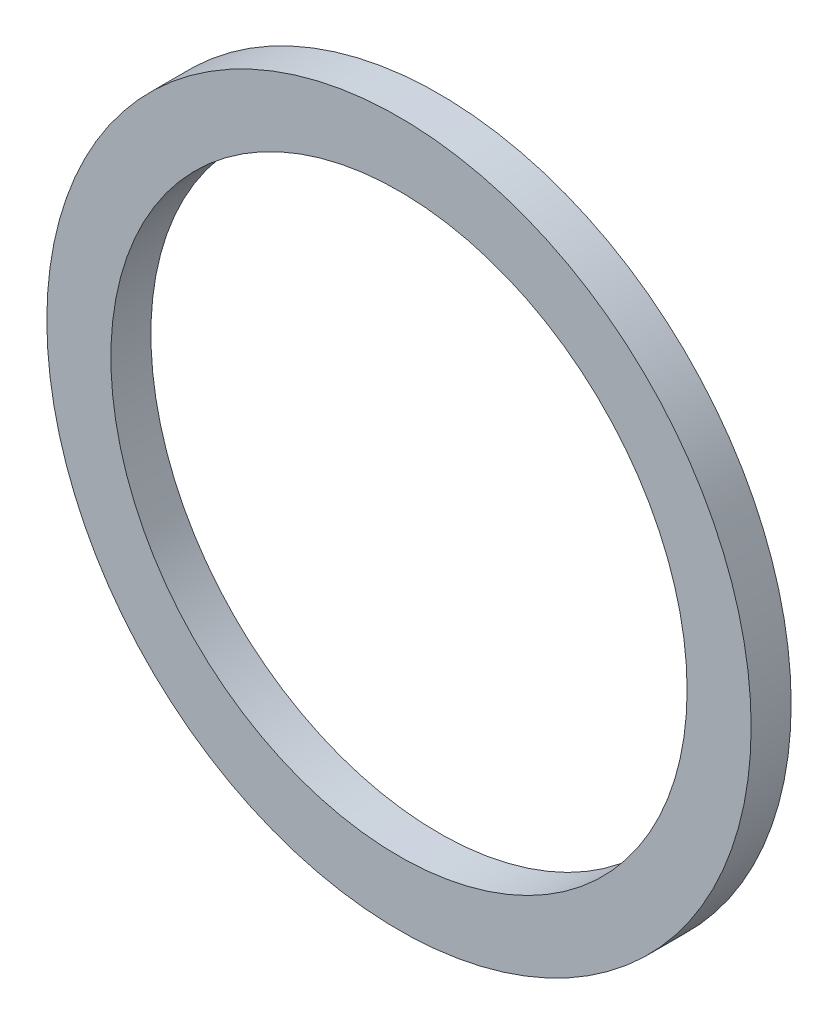
ISO-10303-21;
HEADER;
FILE_DESCRIPTION(('STEP AP214'),'2;1');
FILE_NAME('part.step','',(''),(''),'','','');
FILE_SCHEMA(('AUTOMOTIVE_DESIGN { 1 0 10303 214 1 1 1 1 }'));
ENDSEC;
DATA;
#1=APPLICATION_CONTEXT('core data for automotive mechanical design processes');
#2=APPLICATION_PROTOCOL_DEFINITION('international standard','automotive_design',2000,#1);
#3=PRODUCT_CONTEXT('',#1,'mechanical');
#4=PRODUCT('Part','Part','',(#3));
#5=PRODUCT_RELATED_PRODUCT_CATEGORY('part','',(#4));
#6=PRODUCT_DEFINITION_FORMATION('','',#4);
#7=PRODUCT_DEFINITION_CONTEXT('part definition',#1,'design');
#8=PRODUCT_DEFINITION('design','',#6,#7);
#9=PRODUCT_DEFINITION_SHAPE('','',#8);
#10=(LENGTH_UNIT() NAMED_UNIT(*) SI_UNIT(.MILLI.,.METRE.));
#11=(NAMED_UNIT(*) PLANE_ANGLE_UNIT() SI_UNIT($,.RADIAN.));
#12=(NAMED_UNIT(*) SI_UNIT($,.STERADIAN.) SOLID_ANGLE_UNIT());
#13=UNCERTAINTY_MEASURE_WITH_UNIT(LENGTH_MEASURE(1.E-05),#10,'distance_accuracy_value','');
#14=(GEOMETRIC_REPRESENTATION_CONTEXT(3) GLOBAL_UNCERTAINTY_ASSIGNED_CONTEXT((#13)) GLOBAL_UNIT_ASSIGNED_CONTEXT((#10,
#11,#12)) REPRESENTATION_CONTEXT('',''));
#15=CARTESIAN_POINT('',(0.,0.,0.));
#16=DIRECTION('',(0.,0.,1.));
#17=DIRECTION('',(1.,0.,0.));
#18=AXIS2_PLACEMENT_3D('',#15,#16,#17);
#19=CARTESIAN_POINT('',(0.,0.,1.25));
#20=DIRECTION('',(0.,0.,1.));
#21=DIRECTION('',(1.,0.,0.));
#22=AXIS2_PLACEMENT_3D('',#19,#20,#21);
#23=PLANE('',#22);
#24=CARTESIAN_POINT('',(0.,0.,1.25));
#25=DIRECTION('',(0.,0.,1.));
#26=DIRECTION('',(1.,0.,0.));
#27=AXIS2_PLACEMENT_3D('',#24,#25,#26);
#28=CIRCLE('',#27,11.);
#29=CARTESIAN_POINT('',(11.,0.,1.25));
#30=VERTEX_POINT('',#29);
#31=EDGE_CURVE('E10',#30,#30,#28,.T.);
#32=ORIENTED_EDGE('',*,*,#31,.T.);
#33=EDGE_LOOP('',(#32));
#34=FACE_BOUND('',#33,.T.);
#35=CARTESIAN_POINT('',(0.,0.,1.25));
#36=DIRECTION('',(0.,0.,1.));
#37=DIRECTION('',(1.,0.,0.));
#38=AXIS2_PLACEMENT_3D('',#35,#36,#37);
#39=CIRCLE('',#38,9.);
#40=CARTESIAN_POINT('',(9.,0.,1.25));
#41=VERTEX_POINT('',#40);
#42=EDGE_CURVE('E42',#41,#41,#39,.T.);
#43=ORIENTED_EDGE('',*,*,#42,.F.);
#44=EDGE_LOOP('',(#43));
#45=FACE_BOUND('',#44,.T.);
#46=ADVANCED_FACE('F31',(#34,#45),#23,.T.);
#47=CARTESIAN_POINT('',(0.,0.,0.));
#48=DIRECTION('',(0.,0.,1.));
#49=DIRECTION('',(1.,0.,0.));
#50=AXIS2_PLACEMENT_3D('',#47,#48,#49);
#51=PLANE('',#50);
#52=CARTESIAN_POINT('',(0.,0.,0.));
#53=DIRECTION('',(0.,0.,1.));
#54=DIRECTION('',(1.,0.,0.));
#55=AXIS2_PLACEMENT_3D('',#52,#53,#54);
#56=CIRCLE('',#55,11.);
#57=CARTESIAN_POINT('',(11.,0.,0.));
#58=VERTEX_POINT('',#57);
#59=EDGE_CURVE('E38',#58,#58,#56,.T.);
#60=ORIENTED_EDGE('',*,*,#59,.F.);
#61=EDGE_LOOP('',(#60));
#62=FACE_BOUND('',#61,.T.);
#63=CARTESIAN_POINT('',(0.,0.,0.));
#64=DIRECTION('',(0.,0.,1.));
#65=DIRECTION('',(1.,0.,0.));
#66=AXIS2_PLACEMENT_3D('',#63,#64,#65);
#67=CIRCLE('',#66,9.);
#68=CARTESIAN_POINT('',(9.,0.,0.));
#69=VERTEX_POINT('',#68);
#70=EDGE_CURVE('E46',#69,#69,#67,.T.);
#71=ORIENTED_EDGE('',*,*,#70,.T.);
#72=EDGE_LOOP('',(#71));
#73=FACE_BOUND('',#72,.T.);
#74=ADVANCED_FACE('F52',(#62,#73),#51,.F.);
#75=CARTESIAN_POINT('',(0.,0.,1.25));
#76=DIRECTION('',(0.,0.,-1.));
#77=DIRECTION('',(-1.,0.,0.));
#78=AXIS2_PLACEMENT_3D('',#75,#76,#77);
#79=CYLINDRICAL_SURFACE('',#78,11.);
#80=ORIENTED_EDGE('',*,*,#31,.F.);
#81=EDGE_LOOP('',(#80));
#82=FACE_BOUND('',#81,.T.);
#83=ORIENTED_EDGE('',*,*,#59,.T.);
#84=EDGE_LOOP('',(#83));
#85=FACE_BOUND('',#84,.T.);
#86=ADVANCED_FACE('F33',(#82,#85),#79,.T.);
#87=CARTESIAN_POINT('',(0.,0.,1.25));
#88=DIRECTION('',(0.,0.,-1.));
#89=DIRECTION('',(-1.,0.,0.));
#90=AXIS2_PLACEMENT_3D('',#87,#88,#89);
#91=CYLINDRICAL_SURFACE('',#90,9.);
#92=ORIENTED_EDGE('',*,*,#42,.T.);
#93=EDGE_LOOP('',(#92));
#94=FACE_BOUND('',#93,.T.);
#95=ORIENTED_EDGE('',*,*,#70,.F.);
#96=EDGE_LOOP('',(#95));
#97=FACE_BOUND('',#96,.T.);
#98=ADVANCED_FACE('F54',(#94,#97),#91,.F.);
#99=CLOSED_SHELL('',(#46,#74,#86,#98));
#100=MANIFOLD_SOLID_BREP('B2',#99);
#101=ADVANCED_BREP_SHAPE_REPRESENTATION('',(#18,#100),#14);
#102=SHAPE_DEFINITION_REPRESENTATION(#9,#101);
ENDSEC;
END-ISO-10303-21;
